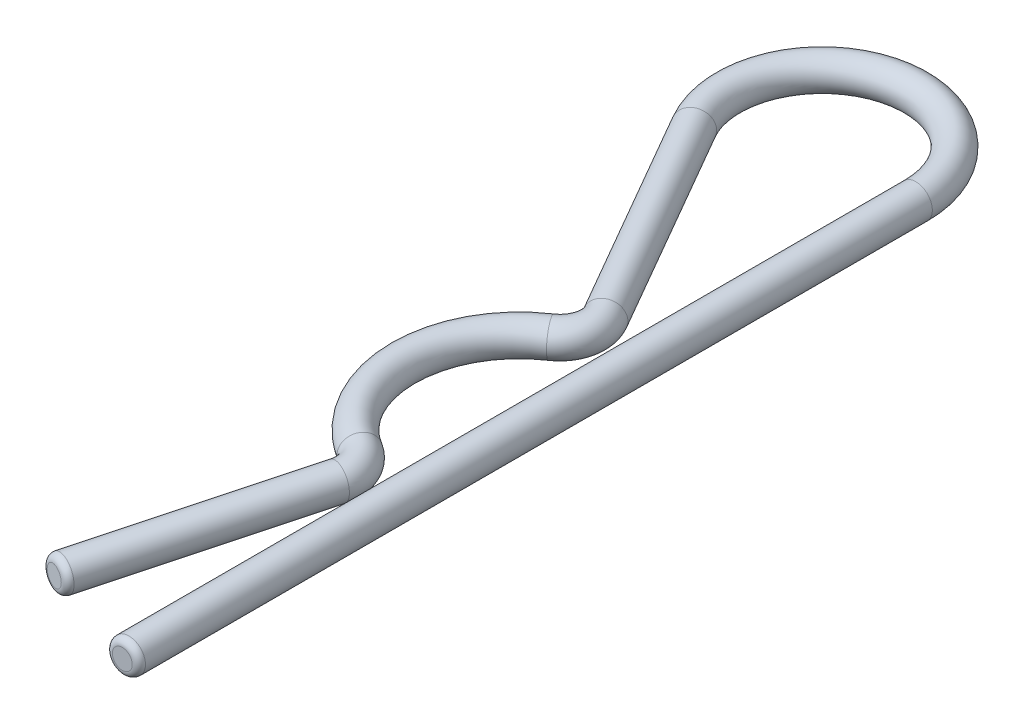
ISO-10303-21;
HEADER;
FILE_DESCRIPTION(('STEP AP214'),'2;1');
FILE_NAME('part.step','',(''),(''),'','','');
FILE_SCHEMA(('AUTOMOTIVE_DESIGN { 1 0 10303 214 1 1 1 1 }'));
ENDSEC;
DATA;
#1=APPLICATION_CONTEXT('core data for automotive mechanical design processes');
#2=APPLICATION_PROTOCOL_DEFINITION('international standard','automotive_design',2000,#1);
#3=PRODUCT_CONTEXT('',#1,'mechanical');
#4=PRODUCT('Part','Part','',(#3));
#5=PRODUCT_RELATED_PRODUCT_CATEGORY('part','',(#4));
#6=PRODUCT_DEFINITION_FORMATION('','',#4);
#7=PRODUCT_DEFINITION_CONTEXT('part definition',#1,'design');
#8=PRODUCT_DEFINITION('design','',#6,#7);
#9=PRODUCT_DEFINITION_SHAPE('','',#8);
#10=(LENGTH_UNIT() NAMED_UNIT(*) SI_UNIT(.MILLI.,.METRE.));
#11=(NAMED_UNIT(*) PLANE_ANGLE_UNIT() SI_UNIT($,.RADIAN.));
#12=(NAMED_UNIT(*) SI_UNIT($,.STERADIAN.) SOLID_ANGLE_UNIT());
#13=UNCERTAINTY_MEASURE_WITH_UNIT(LENGTH_MEASURE(1.E-05),#10,'distance_accuracy_value','');
#14=(GEOMETRIC_REPRESENTATION_CONTEXT(3) GLOBAL_UNCERTAINTY_ASSIGNED_CONTEXT((#13)) GLOBAL_UNIT_ASSIGNED_CONTEXT((#10,
#11,#12)) REPRESENTATION_CONTEXT('',''));
#15=CARTESIAN_POINT('',(0.,0.,0.));
#16=DIRECTION('',(0.,0.,1.));
#17=DIRECTION('',(1.,0.,0.));
#18=AXIS2_PLACEMENT_3D('',#15,#16,#17);
#19=CARTESIAN_POINT('',(0.,0.,60.));
#20=DIRECTION('',(0.,0.,-1.));
#21=DIRECTION('',(-1.,0.,0.));
#22=AXIS2_PLACEMENT_3D('',#19,#20,#21);
#23=PLANE('',#22);
#24=CARTESIAN_POINT('',(0.,0.,60.));
#25=DIRECTION('',(0.,0.,-1.));
#26=DIRECTION('',(-1.,0.,0.));
#27=AXIS2_PLACEMENT_3D('',#24,#25,#26);
#28=CIRCLE('',#27,1.5);
#29=CARTESIAN_POINT('',(-1.5,0.,60.));
#30=VERTEX_POINT('',#29);
#31=EDGE_CURVE('E50',#30,#30,#28,.F.);
#32=ORIENTED_EDGE('',*,*,#31,.T.);
#33=EDGE_LOOP('',(#32));
#34=FACE_BOUND('',#33,.T.);
#35=ADVANCED_FACE('F39',(#34),#23,.F.);
#36=CARTESIAN_POINT('',(-16.0424213020219,0.,54.2507540109578));
#37=DIRECTION('',(-0.258819045102514,0.,0.96592582628907));
#38=DIRECTION('',(0.96592582628907,0.,0.258819045102514));
#39=AXIS2_PLACEMENT_3D('',#36,#37,#38);
#40=PLANE('',#39);
#41=CARTESIAN_POINT('',(-16.0424213020219,0.,54.2507540109578));
#42=DIRECTION('',(-0.258819045102514,0.,0.96592582628907));
#43=DIRECTION('',(0.96592582628907,0.,0.258819045102514));
#44=AXIS2_PLACEMENT_3D('',#41,#42,#43);
#45=CIRCLE('',#44,1.5);
#46=CARTESIAN_POINT('',(-14.5935325625883,0.,54.6389825786115));
#47=VERTEX_POINT('',#46);
#48=EDGE_CURVE('E46',#47,#47,#45,.T.);
#49=ORIENTED_EDGE('',*,*,#48,.T.);
#50=EDGE_LOOP('',(#49));
#51=FACE_BOUND('',#50,.T.);
#52=ADVANCED_FACE('F82',(#51),#40,.T.);
#53=CARTESIAN_POINT('',(0.,0.,60.));
#54=DIRECTION('',(0.,0.,-1.));
#55=DIRECTION('',(-1.,0.,0.));
#56=AXIS2_PLACEMENT_3D('',#53,#54,#55);
#57=CYLINDRICAL_SURFACE('',#56,2.5);
#58=CARTESIAN_POINT('',(0.,0.,59.));
#59=DIRECTION('',(0.,0.,-1.));
#60=DIRECTION('',(-1.,0.,0.));
#61=AXIS2_PLACEMENT_3D('',#58,#59,#60);
#62=CIRCLE('',#61,2.5);
#63=CARTESIAN_POINT('',(-2.5,0.,59.));
#64=VERTEX_POINT('',#63);
#65=EDGE_CURVE('E54',#64,#64,#62,.T.);
#66=ORIENTED_EDGE('',*,*,#65,.T.);
#67=EDGE_LOOP('',(#66));
#68=FACE_BOUND('',#67,.T.);
#69=CARTESIAN_POINT('',(0.,0.,-60.));
#70=DIRECTION('',(0.,0.,-1.));
#71=DIRECTION('',(-1.,0.,0.));
#72=AXIS2_PLACEMENT_3D('',#69,#70,#71);
#73=CIRCLE('',#72,2.5);
#74=CARTESIAN_POINT('',(2.5,0.,-60.));
#75=VERTEX_POINT('',#74);
#76=EDGE_CURVE('E74',#75,#75,#73,.T.);
#77=ORIENTED_EDGE('',*,*,#76,.F.);
#78=EDGE_LOOP('',(#77));
#79=FACE_BOUND('',#78,.T.);
#80=ADVANCED_FACE('F80',(#68,#79),#57,.T.);
#81=CARTESIAN_POINT('',(-14.1730938899245,0.,-60.));
#82=DIRECTION('',(0.,1.,0.));
#83=DIRECTION('',(0.,0.,1.));
#84=AXIS2_PLACEMENT_3D('',#81,#82,#83);
#85=TOROIDAL_SURFACE('',#84,14.1730938899245,2.5);
#86=CARTESIAN_POINT('',(-26.4510960239577,0.,-52.9199396888663));
#87=DIRECTION('',(0.499542327604761,0.,0.86628947986872));
#88=DIRECTION('',(0.86628947986872,0.,-0.499542327604761));
#89=AXIS2_PLACEMENT_3D('',#86,#87,#88);
#90=CIRCLE('',#89,2.5);
#91=CARTESIAN_POINT('',(-28.6168197236295,0.,-51.6710838698544));
#92=VERTEX_POINT('',#91);
#93=EDGE_CURVE('E71',#92,#92,#90,.T.);
#94=CARTESIAN_POINT('',(-14.1730938899245,0.,-60.));
#95=DIRECTION('',(0.,1.,0.));
#96=DIRECTION('',(0.,0.,1.));
#97=AXIS2_PLACEMENT_3D('',#94,#95,#96);
#98=CIRCLE('',#97,16.6730938899245);
#99=EDGE_CURVE('',#75,#92,#98,.T.);
#100=ORIENTED_EDGE('',*,*,#76,.T.);
#101=ORIENTED_EDGE('',*,*,#93,.F.);
#102=ORIENTED_EDGE('',*,*,#99,.T.);
#103=ORIENTED_EDGE('',*,*,#99,.F.);
#104=EDGE_LOOP('',(#100,#102,#101,#103));
#105=FACE_BOUND('',#104,.T.);
#106=ADVANCED_FACE('F78',(#105),#85,.T.);
#107=CARTESIAN_POINT('',(-26.4510960239577,0.,-52.9199396888663));
#108=DIRECTION('',(0.499542327604761,0.,0.86628947986872));
#109=DIRECTION('',(0.86628947986872,0.,-0.499542327604761));
#110=AXIS2_PLACEMENT_3D('',#107,#108,#109);
#111=CYLINDRICAL_SURFACE('',#110,2.5);
#112=CARTESIAN_POINT('',(-8.16481845520299,0.,-21.2084930138107));
#113=DIRECTION('',(0.499542327604761,0.,0.86628947986872));
#114=DIRECTION('',(0.86628947986872,0.,-0.499542327604761));
#115=AXIS2_PLACEMENT_3D('',#112,#113,#114);
#116=CIRCLE('',#115,2.5);
#117=CARTESIAN_POINT('',(-5.99909475553119,0.,-22.4573488328226));
#118=VERTEX_POINT('',#117);
#119=EDGE_CURVE('E68',#118,#118,#116,.T.);
#120=ORIENTED_EDGE('',*,*,#119,.F.);
#121=EDGE_LOOP('',(#120));
#122=FACE_BOUND('',#121,.T.);
#123=ORIENTED_EDGE('',*,*,#93,.T.);
#124=EDGE_LOOP('',(#123));
#125=FACE_BOUND('',#124,.T.);
#126=ADVANCED_FACE('F89',(#122,#125),#111,.T.);
#127=CARTESIAN_POINT('',(-12.4962658545467,0.,-18.7107813757869));
#128=DIRECTION('',(0.,-1.,0.));
#129=DIRECTION('',(0.,0.,-1.));
#130=AXIS2_PLACEMENT_3D('',#127,#128,#129);
#131=TOROIDAL_SURFACE('',#130,5.00000000000007,2.5);
#132=CARTESIAN_POINT('',(-9.71931788686956,0.,-14.5528299589453));
#133=DIRECTION('',(-0.831590283368296,0.,0.555389593535419));
#134=DIRECTION('',(0.555389593535418,0.,0.831590283368296));
#135=AXIS2_PLACEMENT_3D('',#132,#133,#134);
#136=CIRCLE('',#135,2.5);
#137=CARTESIAN_POINT('',(-8.33084390303101,0.,-12.4738542505246));
#138=VERTEX_POINT('',#137);
#139=EDGE_CURVE('E65',#138,#138,#136,.T.);
#140=CARTESIAN_POINT('',(-12.4962658545467,0.,-18.7107813757869));
#141=DIRECTION('',(0.,-1.,0.));
#142=DIRECTION('',(0.,0.,-1.));
#143=AXIS2_PLACEMENT_3D('',#140,#141,#142);
#144=CIRCLE('',#143,7.50000000000007);
#145=EDGE_CURVE('',#118,#138,#144,.T.);
#146=ORIENTED_EDGE('',*,*,#119,.T.);
#147=ORIENTED_EDGE('',*,*,#139,.F.);
#148=ORIENTED_EDGE('',*,*,#145,.T.);
#149=ORIENTED_EDGE('',*,*,#145,.F.);
#150=EDGE_LOOP('',(#146,#148,#147,#149));
#151=FACE_BOUND('',#150,.T.);
#152=ADVANCED_FACE('F137',(#151),#131,.T.);
#153=CARTESIAN_POINT('',(0.,0.,0.));
#154=DIRECTION('',(0.,1.,0.));
#155=DIRECTION('',(0.,0.,1.));
#156=AXIS2_PLACEMENT_3D('',#153,#154,#155);
#157=TOROIDAL_SURFACE('',#156,17.5,2.5);
#158=CARTESIAN_POINT('',(-9.18818744268387,0.,14.8938648952549));
#159=DIRECTION('',(0.851077994014566,0.,0.525039282439078));
#160=DIRECTION('',(0.525039282439078,0.,-0.851077994014566));
#161=AXIS2_PLACEMENT_3D('',#158,#159,#160);
#162=CIRCLE('',#161,2.5);
#163=CARTESIAN_POINT('',(-7.87558923658623,0.,12.7661699102185));
#164=VERTEX_POINT('',#163);
#165=EDGE_CURVE('E62',#164,#164,#162,.T.);
#166=ORIENTED_EDGE('',*,*,#165,.F.);
#167=EDGE_LOOP('',(#166));
#168=FACE_BOUND('',#167,.T.);
#169=ORIENTED_EDGE('',*,*,#139,.T.);
#170=EDGE_LOOP('',(#169));
#171=FACE_BOUND('',#170,.T.);
#172=ADVANCED_FACE('F102',(#168,#171),#157,.T.);
#173=CARTESIAN_POINT('',(-11.8133838548792,0.,19.1492548653277));
#174=DIRECTION('',(0.,-1.,0.));
#175=DIRECTION('',(0.,0.,-1.));
#176=AXIS2_PLACEMENT_3D('',#173,#174,#175);
#177=TOROIDAL_SURFACE('',#176,4.99999999999991,2.5);
#178=CARTESIAN_POINT('',(-6.98375472343389,0.,20.4433500908403));
#179=DIRECTION('',(-0.258819045102521,0.,0.965925826289068));
#180=DIRECTION('',(0.965925826289068,0.,0.258819045102521));
#181=AXIS2_PLACEMENT_3D('',#178,#179,#180);
#182=CIRCLE('',#181,2.5);
#183=CARTESIAN_POINT('',(-4.56894015771122,0.,21.0903977035966));
#184=VERTEX_POINT('',#183);
#185=EDGE_CURVE('E59',#184,#184,#182,.T.);
#186=CARTESIAN_POINT('',(-11.8133838548792,0.,19.1492548653277));
#187=DIRECTION('',(0.,-1.,0.));
#188=DIRECTION('',(0.,0.,-1.));
#189=AXIS2_PLACEMENT_3D('',#186,#187,#188);
#190=CIRCLE('',#189,7.49999999999991);
#191=EDGE_CURVE('',#164,#184,#190,.T.);
#192=ORIENTED_EDGE('',*,*,#165,.T.);
#193=ORIENTED_EDGE('',*,*,#185,.F.);
#194=ORIENTED_EDGE('',*,*,#191,.T.);
#195=ORIENTED_EDGE('',*,*,#191,.F.);
#196=EDGE_LOOP('',(#192,#194,#193,#195));
#197=FACE_BOUND('',#196,.T.);
#198=ADVANCED_FACE('F97',(#197),#177,.T.);
#199=CARTESIAN_POINT('',(-6.98375472343391,0.,20.4433500908403));
#200=DIRECTION('',(-0.258819045102514,0.,0.96592582628907));
#201=DIRECTION('',(0.96592582628907,0.,0.258819045102514));
#202=AXIS2_PLACEMENT_3D('',#199,#200,#201);
#203=CYLINDRICAL_SURFACE('',#202,2.5);
#204=CARTESIAN_POINT('',(-15.7836022569194,0.,53.2848281846687));
#205=DIRECTION('',(-0.258819045102514,0.,0.96592582628907));
#206=DIRECTION('',(0.96592582628907,0.,0.258819045102514));
#207=AXIS2_PLACEMENT_3D('',#204,#205,#206);
#208=CIRCLE('',#207,2.5);
#209=CARTESIAN_POINT('',(-13.3687876911967,0.,53.931875797425));
#210=VERTEX_POINT('',#209);
#211=EDGE_CURVE('E10',#210,#210,#208,.F.);
#212=ORIENTED_EDGE('',*,*,#211,.T.);
#213=EDGE_LOOP('',(#212));
#214=FACE_BOUND('',#213,.T.);
#215=ORIENTED_EDGE('',*,*,#185,.T.);
#216=EDGE_LOOP('',(#215));
#217=FACE_BOUND('',#216,.T.);
#218=ADVANCED_FACE('F94',(#214,#217),#203,.T.);
#219=CARTESIAN_POINT('',(0.,0.,59.));
#220=DIRECTION('',(0.,0.,-1.));
#221=DIRECTION('',(-1.,0.,0.));
#222=AXIS2_PLACEMENT_3D('',#219,#220,#221);
#223=TOROIDAL_SURFACE('',#222,1.5,1.);
#224=ORIENTED_EDGE('',*,*,#31,.F.);
#225=EDGE_LOOP('',(#224));
#226=FACE_BOUND('',#225,.T.);
#227=ORIENTED_EDGE('',*,*,#65,.F.);
#228=EDGE_LOOP('',(#227));
#229=FACE_BOUND('',#228,.T.);
#230=ADVANCED_FACE('F96',(#226,#229),#223,.T.);
#231=CARTESIAN_POINT('',(-15.7836022569194,0.,53.2848281846687));
#232=DIRECTION('',(-0.258819045102514,0.,0.96592582628907));
#233=DIRECTION('',(0.96592582628907,0.,0.258819045102514));
#234=AXIS2_PLACEMENT_3D('',#231,#232,#233);
#235=TOROIDAL_SURFACE('',#234,1.5,1.);
#236=ORIENTED_EDGE('',*,*,#211,.F.);
#237=EDGE_LOOP('',(#236));
#238=FACE_BOUND('',#237,.T.);
#239=ORIENTED_EDGE('',*,*,#48,.F.);
#240=EDGE_LOOP('',(#239));
#241=FACE_BOUND('',#240,.T.);
#242=ADVANCED_FACE('F41',(#238,#241),#235,.T.);
#243=CLOSED_SHELL('',(#35,#52,#80,#106,#126,#152,#172,#198,#218,#230,#242));
#244=MANIFOLD_SOLID_BREP('B2',#243);
#245=ADVANCED_BREP_SHAPE_REPRESENTATION('',(#18,#244),#14);
#246=SHAPE_DEFINITION_REPRESENTATION(#9,#245);
ENDSEC;
END-ISO-10303-21;
